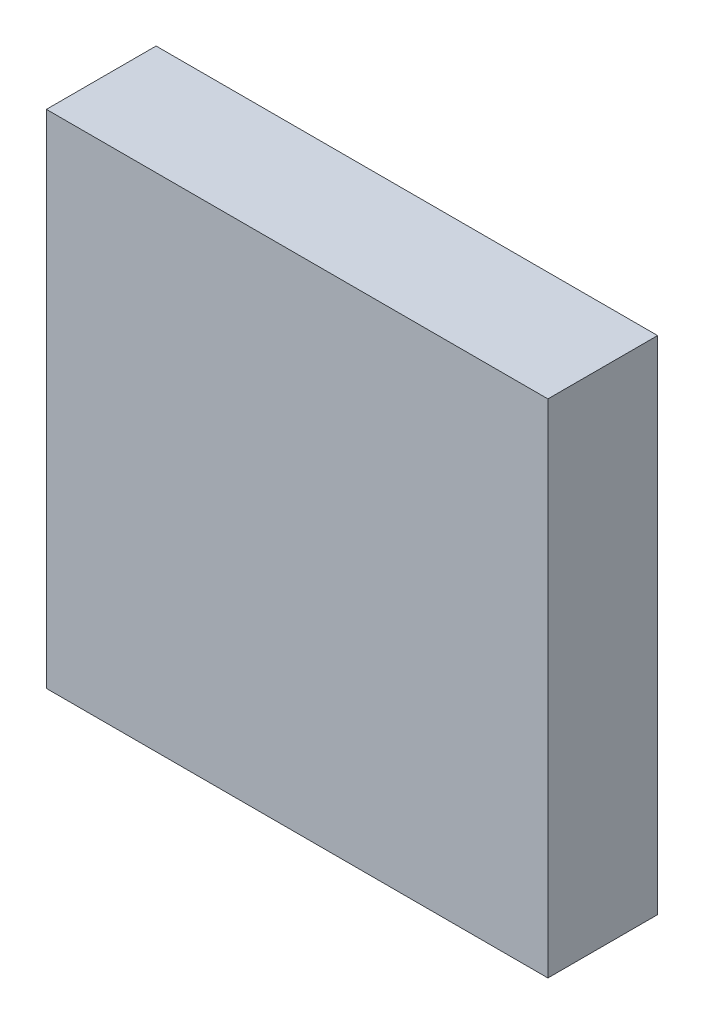
ISO-10303-21;
HEADER;
FILE_DESCRIPTION(('STEP AP214'),'2;1');
FILE_NAME('part.step','',(''),(''),'','','');
FILE_SCHEMA(('AUTOMOTIVE_DESIGN { 1 0 10303 214 1 1 1 1 }'));
ENDSEC;
DATA;
#1=APPLICATION_CONTEXT('core data for automotive mechanical design processes');
#2=APPLICATION_PROTOCOL_DEFINITION('international standard','automotive_design',2000,#1);
#3=PRODUCT_CONTEXT('',#1,'mechanical');
#4=PRODUCT('Part','Part','',(#3));
#5=PRODUCT_RELATED_PRODUCT_CATEGORY('part','',(#4));
#6=PRODUCT_DEFINITION_FORMATION('','',#4);
#7=PRODUCT_DEFINITION_CONTEXT('part definition',#1,'design');
#8=PRODUCT_DEFINITION('design','',#6,#7);
#9=PRODUCT_DEFINITION_SHAPE('','',#8);
#10=(LENGTH_UNIT() NAMED_UNIT(*) SI_UNIT(.MILLI.,.METRE.));
#11=(NAMED_UNIT(*) PLANE_ANGLE_UNIT() SI_UNIT($,.RADIAN.));
#12=(NAMED_UNIT(*) SI_UNIT($,.STERADIAN.) SOLID_ANGLE_UNIT());
#13=UNCERTAINTY_MEASURE_WITH_UNIT(LENGTH_MEASURE(1.E-05),#10,'distance_accuracy_value','');
#14=(GEOMETRIC_REPRESENTATION_CONTEXT(3) GLOBAL_UNCERTAINTY_ASSIGNED_CONTEXT((#13)) GLOBAL_UNIT_ASSIGNED_CONTEXT((#10,
#11,#12)) REPRESENTATION_CONTEXT('',''));
#15=CARTESIAN_POINT('',(0.,0.,0.));
#16=DIRECTION('',(0.,0.,1.));
#17=DIRECTION('',(1.,0.,0.));
#18=AXIS2_PLACEMENT_3D('',#15,#16,#17);
#19=CARTESIAN_POINT('',(16.,16.,7.));
#20=DIRECTION('',(-1.,0.,0.));
#21=DIRECTION('',(0.,-1.,0.));
#22=AXIS2_PLACEMENT_3D('',#19,#20,#21);
#23=PLANE('',#22);
#24=DIRECTION('',(0.,1.,0.));
#25=VECTOR('',#24,1.);
#26=CARTESIAN_POINT('',(16.,16.,0.));
#27=LINE('',#26,#25);
#28=CARTESIAN_POINT('',(16.,-16.,0.));
#29=VERTEX_POINT('',#28);
#30=CARTESIAN_POINT('',(16.,16.,0.));
#31=VERTEX_POINT('',#30);
#32=EDGE_CURVE('E96',#29,#31,#27,.T.);
#33=ORIENTED_EDGE('',*,*,#32,.T.);
#34=DIRECTION('',(0.,0.,-1.));
#35=VECTOR('',#34,1.);
#36=CARTESIAN_POINT('',(16.,16.,7.));
#37=LINE('',#36,#35);
#38=CARTESIAN_POINT('',(16.,16.,7.));
#39=VERTEX_POINT('',#38);
#40=EDGE_CURVE('E11',#39,#31,#37,.T.);
#41=ORIENTED_EDGE('',*,*,#40,.F.);
#42=DIRECTION('',(0.,1.,0.));
#43=VECTOR('',#42,1.);
#44=CARTESIAN_POINT('',(16.,16.,7.));
#45=LINE('',#44,#43);
#46=CARTESIAN_POINT('',(16.,-16.,7.));
#47=VERTEX_POINT('',#46);
#48=EDGE_CURVE('E84',#47,#39,#45,.T.);
#49=ORIENTED_EDGE('',*,*,#48,.F.);
#50=DIRECTION('',(0.,0.,-1.));
#51=VECTOR('',#50,1.);
#52=CARTESIAN_POINT('',(16.,-16.,7.));
#53=LINE('',#52,#51);
#54=EDGE_CURVE('E92',#47,#29,#53,.T.);
#55=ORIENTED_EDGE('',*,*,#54,.T.);
#56=EDGE_LOOP('',(#33,#41,#49,#55));
#57=FACE_BOUND('',#56,.T.);
#58=ADVANCED_FACE('F33',(#57),#23,.F.);
#59=CARTESIAN_POINT('',(-16.,16.,7.));
#60=DIRECTION('',(0.,-1.,0.));
#61=DIRECTION('',(0.,0.,-1.));
#62=AXIS2_PLACEMENT_3D('',#59,#60,#61);
#63=PLANE('',#62);
#64=DIRECTION('',(-1.,0.,0.));
#65=VECTOR('',#64,1.);
#66=CARTESIAN_POINT('',(-16.,16.,0.));
#67=LINE('',#66,#65);
#68=CARTESIAN_POINT('',(-16.,16.,0.));
#69=VERTEX_POINT('',#68);
#70=EDGE_CURVE('E88',#31,#69,#67,.T.);
#71=ORIENTED_EDGE('',*,*,#70,.T.);
#72=DIRECTION('',(0.,0.,-1.));
#73=VECTOR('',#72,1.);
#74=CARTESIAN_POINT('',(-16.,16.,7.));
#75=LINE('',#74,#73);
#76=CARTESIAN_POINT('',(-16.,16.,7.));
#77=VERTEX_POINT('',#76);
#78=EDGE_CURVE('E41',#77,#69,#75,.T.);
#79=ORIENTED_EDGE('',*,*,#78,.F.);
#80=DIRECTION('',(-1.,0.,0.));
#81=VECTOR('',#80,1.);
#82=CARTESIAN_POINT('',(-16.,16.,7.));
#83=LINE('',#82,#81);
#84=EDGE_CURVE('E79',#39,#77,#83,.T.);
#85=ORIENTED_EDGE('',*,*,#84,.F.);
#86=ORIENTED_EDGE('',*,*,#40,.T.);
#87=EDGE_LOOP('',(#71,#79,#85,#86));
#88=FACE_BOUND('',#87,.T.);
#89=ADVANCED_FACE('F87',(#88),#63,.F.);
#90=CARTESIAN_POINT('',(-16.,16.,7.));
#91=DIRECTION('',(1.,0.,0.));
#92=DIRECTION('',(0.,1.,0.));
#93=AXIS2_PLACEMENT_3D('',#90,#91,#92);
#94=PLANE('',#93);
#95=DIRECTION('',(0.,-1.,0.));
#96=VECTOR('',#95,1.);
#97=CARTESIAN_POINT('',(-16.,16.,0.));
#98=LINE('',#97,#96);
#99=CARTESIAN_POINT('',(-16.,-16.,0.));
#100=VERTEX_POINT('',#99);
#101=EDGE_CURVE('E66',#69,#100,#98,.T.);
#102=ORIENTED_EDGE('',*,*,#101,.T.);
#103=DIRECTION('',(0.,0.,-1.));
#104=VECTOR('',#103,1.);
#105=CARTESIAN_POINT('',(-16.,-16.,7.));
#106=LINE('',#105,#104);
#107=CARTESIAN_POINT('',(-16.,-16.,7.));
#108=VERTEX_POINT('',#107);
#109=EDGE_CURVE('E89',#108,#100,#106,.T.);
#110=ORIENTED_EDGE('',*,*,#109,.F.);
#111=DIRECTION('',(0.,-1.,0.));
#112=VECTOR('',#111,1.);
#113=CARTESIAN_POINT('',(-16.,16.,7.));
#114=LINE('',#113,#112);
#115=EDGE_CURVE('E82',#77,#108,#114,.T.);
#116=ORIENTED_EDGE('',*,*,#115,.F.);
#117=ORIENTED_EDGE('',*,*,#78,.T.);
#118=EDGE_LOOP('',(#102,#110,#116,#117));
#119=FACE_BOUND('',#118,.T.);
#120=ADVANCED_FACE('F90',(#119),#94,.F.);
#121=CARTESIAN_POINT('',(-16.,-16.,7.));
#122=DIRECTION('',(0.,1.,0.));
#123=DIRECTION('',(0.,0.,1.));
#124=AXIS2_PLACEMENT_3D('',#121,#122,#123);
#125=PLANE('',#124);
#126=DIRECTION('',(1.,0.,0.));
#127=VECTOR('',#126,1.);
#128=CARTESIAN_POINT('',(-16.,-16.,0.));
#129=LINE('',#128,#127);
#130=EDGE_CURVE('E72',#100,#29,#129,.T.);
#131=ORIENTED_EDGE('',*,*,#130,.T.);
#132=ORIENTED_EDGE('',*,*,#54,.F.);
#133=DIRECTION('',(1.,0.,0.));
#134=VECTOR('',#133,1.);
#135=CARTESIAN_POINT('',(-16.,-16.,7.));
#136=LINE('',#135,#134);
#137=EDGE_CURVE('E49',#108,#47,#136,.T.);
#138=ORIENTED_EDGE('',*,*,#137,.F.);
#139=ORIENTED_EDGE('',*,*,#109,.T.);
#140=EDGE_LOOP('',(#131,#132,#138,#139));
#141=FACE_BOUND('',#140,.T.);
#142=ADVANCED_FACE('F103',(#141),#125,.F.);
#143=CARTESIAN_POINT('',(0.,0.,7.));
#144=DIRECTION('',(0.,0.,1.));
#145=DIRECTION('',(1.,0.,0.));
#146=AXIS2_PLACEMENT_3D('',#143,#144,#145);
#147=PLANE('',#146);
#148=ORIENTED_EDGE('',*,*,#48,.T.);
#149=ORIENTED_EDGE('',*,*,#84,.T.);
#150=ORIENTED_EDGE('',*,*,#115,.T.);
#151=ORIENTED_EDGE('',*,*,#137,.T.);
#152=EDGE_LOOP('',(#148,#149,#150,#151));
#153=FACE_BOUND('',#152,.T.);
#154=ADVANCED_FACE('F80',(#153),#147,.T.);
#155=CARTESIAN_POINT('',(0.,0.,0.));
#156=DIRECTION('',(0.,0.,1.));
#157=DIRECTION('',(1.,0.,0.));
#158=AXIS2_PLACEMENT_3D('',#155,#156,#157);
#159=PLANE('',#158);
#160=ORIENTED_EDGE('',*,*,#32,.F.);
#161=ORIENTED_EDGE('',*,*,#130,.F.);
#162=ORIENTED_EDGE('',*,*,#101,.F.);
#163=ORIENTED_EDGE('',*,*,#70,.F.);
#164=EDGE_LOOP('',(#160,#161,#162,#163));
#165=FACE_BOUND('',#164,.T.);
#166=ADVANCED_FACE('F106',(#165),#159,.F.);
#167=CLOSED_SHELL('',(#58,#89,#120,#142,#154,#166));
#168=MANIFOLD_SOLID_BREP('B2',#167);
#169=ADVANCED_BREP_SHAPE_REPRESENTATION('',(#18,#168),#14);
#170=SHAPE_DEFINITION_REPRESENTATION(#9,#169);
ENDSEC;
END-ISO-10303-21;
